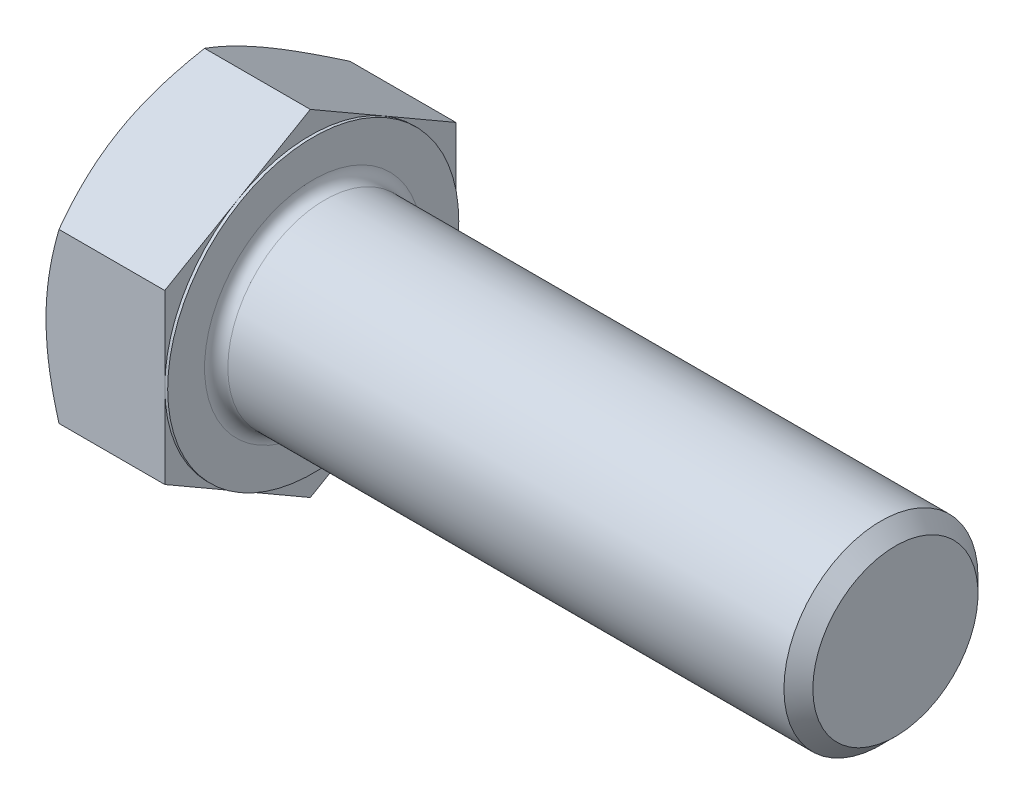
ISO-10303-21;
HEADER;
FILE_DESCRIPTION(('STEP AP214'),'2;1');
FILE_NAME('part.step','',(''),(''),'','','');
FILE_SCHEMA(('AUTOMOTIVE_DESIGN { 1 0 10303 214 1 1 1 1 }'));
ENDSEC;
DATA;
#1=APPLICATION_CONTEXT('core data for automotive mechanical design processes');
#2=APPLICATION_PROTOCOL_DEFINITION('international standard','automotive_design',2000,#1);
#3=PRODUCT_CONTEXT('',#1,'mechanical');
#4=PRODUCT('Part','Part','',(#3));
#5=PRODUCT_RELATED_PRODUCT_CATEGORY('part','',(#4));
#6=PRODUCT_DEFINITION_FORMATION('','',#4);
#7=PRODUCT_DEFINITION_CONTEXT('part definition',#1,'design');
#8=PRODUCT_DEFINITION('design','',#6,#7);
#9=PRODUCT_DEFINITION_SHAPE('','',#8);
#10=(LENGTH_UNIT() NAMED_UNIT(*) SI_UNIT(.MILLI.,.METRE.));
#11=(NAMED_UNIT(*) PLANE_ANGLE_UNIT() SI_UNIT($,.RADIAN.));
#12=(NAMED_UNIT(*) SI_UNIT($,.STERADIAN.) SOLID_ANGLE_UNIT());
#13=UNCERTAINTY_MEASURE_WITH_UNIT(LENGTH_MEASURE(1.E-05),#10,'distance_accuracy_value','');
#14=(GEOMETRIC_REPRESENTATION_CONTEXT(3) GLOBAL_UNCERTAINTY_ASSIGNED_CONTEXT((#13)) GLOBAL_UNIT_ASSIGNED_CONTEXT((#10,
#11,#12)) REPRESENTATION_CONTEXT('',''));
#15=CARTESIAN_POINT('',(0.,0.,0.));
#16=DIRECTION('',(0.,0.,1.));
#17=DIRECTION('',(1.,0.,0.));
#18=AXIS2_PLACEMENT_3D('',#15,#16,#17);
#19=CARTESIAN_POINT('',(15.9258,21.9970452561248,0.));
#20=DIRECTION('',(1.,0.,0.));
#21=DIRECTION('',(0.,0.,-1.));
#22=AXIS2_PLACEMENT_3D('',#19,#20,#21);
#23=PLANE('',#22);
#24=CARTESIAN_POINT('',(15.9258,0.,0.));
#25=DIRECTION('',(1.,0.,0.));
#26=DIRECTION('',(0.,0.,-1.));
#27=AXIS2_PLACEMENT_3D('',#24,#25,#26);
#28=CIRCLE('',#27,14.224);
#29=CARTESIAN_POINT('',(15.9258,0.,-14.224));
#30=VERTEX_POINT('',#29);
#31=EDGE_CURVE('E40',#30,#30,#28,.F.);
#32=ORIENTED_EDGE('',*,*,#31,.T.);
#33=EDGE_LOOP('',(#32));
#34=FACE_BOUND('',#33,.T.);
#35=CARTESIAN_POINT('',(15.9258,0.,0.));
#36=DIRECTION('',(1.,0.,0.));
#37=DIRECTION('',(0.,0.,-1.));
#38=AXIS2_PLACEMENT_3D('',#35,#36,#37);
#39=CIRCLE('',#38,19.05);
#40=CARTESIAN_POINT('',(15.9258,0.,-19.05));
#41=VERTEX_POINT('',#40);
#42=EDGE_CURVE('E291',#41,#41,#39,.T.);
#43=ORIENTED_EDGE('',*,*,#42,.T.);
#44=EDGE_LOOP('',(#43));
#45=FACE_BOUND('',#44,.T.);
#46=ADVANCED_FACE('F32',(#34,#45),#23,.T.);
#47=CARTESIAN_POINT('',(0.,0.,0.));
#48=DIRECTION('',(-1.,0.,0.));
#49=DIRECTION('',(0.,0.,1.));
#50=AXIS2_PLACEMENT_3D('',#47,#48,#49);
#51=CYLINDRICAL_SURFACE('',#50,12.7);
#52=CARTESIAN_POINT('',(17.4498,0.,0.));
#53=DIRECTION('',(1.,0.,0.));
#54=DIRECTION('',(0.,0.,-1.));
#55=AXIS2_PLACEMENT_3D('',#52,#53,#54);
#56=CIRCLE('',#55,12.7);
#57=CARTESIAN_POINT('',(17.4498,0.,-12.7));
#58=VERTEX_POINT('',#57);
#59=EDGE_CURVE('E11',#58,#58,#56,.T.);
#60=ORIENTED_EDGE('',*,*,#59,.T.);
#61=EDGE_LOOP('',(#60));
#62=FACE_BOUND('',#61,.T.);
#63=CARTESIAN_POINT('',(90.2335,0.,0.));
#64=DIRECTION('',(-1.,0.,0.));
#65=DIRECTION('',(0.,0.,1.));
#66=AXIS2_PLACEMENT_3D('',#63,#64,#65);
#67=CIRCLE('',#66,12.7);
#68=CARTESIAN_POINT('',(90.2335,0.,12.7));
#69=VERTEX_POINT('',#68);
#70=EDGE_CURVE('E270',#69,#69,#67,.T.);
#71=ORIENTED_EDGE('',*,*,#70,.T.);
#72=EDGE_LOOP('',(#71));
#73=FACE_BOUND('',#72,.T.);
#74=ADVANCED_FACE('F244',(#62,#73),#51,.T.);
#75=CARTESIAN_POINT('',(92.1258,0.,0.));
#76=DIRECTION('',(-1.,0.,0.));
#77=DIRECTION('',(0.,0.,1.));
#78=AXIS2_PLACEMENT_3D('',#75,#76,#77);
#79=CONICAL_SURFACE('',#78,10.8077,0.785398163397441);
#80=ORIENTED_EDGE('',*,*,#70,.F.);
#81=EDGE_LOOP('',(#80));
#82=FACE_BOUND('',#81,.T.);
#83=CARTESIAN_POINT('',(92.1258,0.,0.));
#84=DIRECTION('',(-1.,0.,0.));
#85=DIRECTION('',(0.,0.,1.));
#86=AXIS2_PLACEMENT_3D('',#83,#84,#85);
#87=CIRCLE('',#86,10.8077);
#88=CARTESIAN_POINT('',(92.1258,0.,10.8077));
#89=VERTEX_POINT('',#88);
#90=EDGE_CURVE('E268',#89,#89,#87,.T.);
#91=ORIENTED_EDGE('',*,*,#90,.T.);
#92=EDGE_LOOP('',(#91));
#93=FACE_BOUND('',#92,.T.);
#94=ADVANCED_FACE('F249',(#82,#93),#79,.T.);
#95=CARTESIAN_POINT('',(92.1258,0.,0.));
#96=DIRECTION('',(-1.,0.,0.));
#97=DIRECTION('',(0.,0.,1.));
#98=AXIS2_PLACEMENT_3D('',#95,#96,#97);
#99=PLANE('',#98);
#100=ORIENTED_EDGE('',*,*,#90,.F.);
#101=EDGE_LOOP('',(#100));
#102=FACE_BOUND('',#101,.T.);
#103=ADVANCED_FACE('F256',(#102),#99,.F.);
#104=CARTESIAN_POINT('',(15.5448,19.05,0.));
#105=DIRECTION('',(1.,0.,0.));
#106=DIRECTION('',(0.,0.,-1.));
#107=AXIS2_PLACEMENT_3D('',#104,#105,#106);
#108=PLANE('',#107);
#109=DIRECTION('',(0.,0.500000000000001,0.866025403784438));
#110=VECTOR('',#109,1.);
#111=CARTESIAN_POINT('',(15.5448,10.9985226280624,-19.05));
#112=LINE('',#111,#110);
#113=CARTESIAN_POINT('',(15.5448,10.9985226280624,-19.05));
#114=VERTEX_POINT('',#113);
#115=CARTESIAN_POINT('',(15.5448,16.4977839420935,-9.52500000000002));
#116=VERTEX_POINT('',#115);
#117=EDGE_CURVE('E164',#114,#116,#112,.T.);
#118=ORIENTED_EDGE('',*,*,#117,.T.);
#119=CARTESIAN_POINT('',(15.5448,0.,0.));
#120=DIRECTION('',(-1.,0.,0.));
#121=DIRECTION('',(0.,0.,1.));
#122=AXIS2_PLACEMENT_3D('',#119,#120,#121);
#123=CIRCLE('',#122,19.05);
#124=CARTESIAN_POINT('',(15.5448,0.,-19.05));
#125=VERTEX_POINT('',#124);
#126=EDGE_CURVE('E47',#116,#125,#123,.T.);
#127=ORIENTED_EDGE('',*,*,#126,.T.);
#128=DIRECTION('',(0.,1.,0.));
#129=VECTOR('',#128,1.);
#130=CARTESIAN_POINT('',(15.5448,10.9985226280624,-19.05));
#131=LINE('',#130,#129);
#132=EDGE_CURVE('E294',#125,#114,#131,.T.);
#133=ORIENTED_EDGE('',*,*,#132,.T.);
#134=EDGE_LOOP('',(#118,#127,#133));
#135=FACE_BOUND('',#134,.T.);
#136=ADVANCED_FACE('F259',(#135),#108,.T.);
#137=CARTESIAN_POINT('',(15.5448,21.9970452561248,0.));
#138=VERTEX_POINT('',#137);
#139=EDGE_CURVE('E162',#116,#138,#112,.T.);
#140=ORIENTED_EDGE('',*,*,#139,.T.);
#141=DIRECTION('',(0.,-0.500000000000001,0.866025403784438));
#142=VECTOR('',#141,1.);
#143=CARTESIAN_POINT('',(15.5448,21.9970452561248,0.));
#144=LINE('',#143,#142);
#145=CARTESIAN_POINT('',(15.5448,16.4977839420935,9.52500000000001));
#146=VERTEX_POINT('',#145);
#147=EDGE_CURVE('E161',#138,#146,#144,.T.);
#148=ORIENTED_EDGE('',*,*,#147,.T.);
#149=EDGE_CURVE('E150',#146,#116,#123,.T.);
#150=ORIENTED_EDGE('',*,*,#149,.T.);
#151=EDGE_LOOP('',(#140,#148,#150));
#152=FACE_BOUND('',#151,.T.);
#153=ADVANCED_FACE('F264',(#152),#108,.T.);
#154=CARTESIAN_POINT('',(15.5448,10.9985226280624,19.05));
#155=VERTEX_POINT('',#154);
#156=EDGE_CURVE('E129',#146,#155,#144,.T.);
#157=ORIENTED_EDGE('',*,*,#156,.T.);
#158=DIRECTION('',(0.,-1.,0.));
#159=VECTOR('',#158,1.);
#160=CARTESIAN_POINT('',(15.5448,10.9985226280624,19.05));
#161=LINE('',#160,#159);
#162=CARTESIAN_POINT('',(15.5448,0.,19.05));
#163=VERTEX_POINT('',#162);
#164=EDGE_CURVE('E123',#155,#163,#161,.T.);
#165=ORIENTED_EDGE('',*,*,#164,.T.);
#166=EDGE_CURVE('E127',#163,#146,#123,.T.);
#167=ORIENTED_EDGE('',*,*,#166,.T.);
#168=EDGE_LOOP('',(#157,#165,#167));
#169=FACE_BOUND('',#168,.T.);
#170=ADVANCED_FACE('F125',(#169),#108,.T.);
#171=CARTESIAN_POINT('',(15.5448,-10.9985226280623,19.05));
#172=VERTEX_POINT('',#171);
#173=EDGE_CURVE('E133',#163,#172,#161,.T.);
#174=ORIENTED_EDGE('',*,*,#173,.T.);
#175=DIRECTION('',(0.,-0.500000000000002,-0.866025403784438));
#176=VECTOR('',#175,1.);
#177=CARTESIAN_POINT('',(15.5448,-21.9970452561248,0.));
#178=LINE('',#177,#176);
#179=CARTESIAN_POINT('',(15.5448,-16.4977839420935,9.52500000000003));
#180=VERTEX_POINT('',#179);
#181=EDGE_CURVE('E140',#172,#180,#178,.T.);
#182=ORIENTED_EDGE('',*,*,#181,.T.);
#183=EDGE_CURVE('E137',#180,#163,#123,.T.);
#184=ORIENTED_EDGE('',*,*,#183,.T.);
#185=EDGE_LOOP('',(#174,#182,#184));
#186=FACE_BOUND('',#185,.T.);
#187=ADVANCED_FACE('F138',(#186),#108,.T.);
#188=CARTESIAN_POINT('',(15.5448,-21.9970452561248,0.));
#189=VERTEX_POINT('',#188);
#190=EDGE_CURVE('E156',#180,#189,#178,.T.);
#191=ORIENTED_EDGE('',*,*,#190,.T.);
#192=DIRECTION('',(0.,0.5,-0.866025403784439));
#193=VECTOR('',#192,1.);
#194=CARTESIAN_POINT('',(15.5448,-10.9985226280624,-19.05));
#195=LINE('',#194,#193);
#196=CARTESIAN_POINT('',(15.5448,-16.4977839420936,-9.525));
#197=VERTEX_POINT('',#196);
#198=EDGE_CURVE('E332',#189,#197,#195,.T.);
#199=ORIENTED_EDGE('',*,*,#198,.T.);
#200=EDGE_CURVE('E144',#197,#180,#123,.T.);
#201=ORIENTED_EDGE('',*,*,#200,.T.);
#202=EDGE_LOOP('',(#191,#199,#201));
#203=FACE_BOUND('',#202,.T.);
#204=ADVANCED_FACE('F333',(#203),#108,.T.);
#205=CARTESIAN_POINT('',(15.5448,-10.9985226280624,-19.05));
#206=VERTEX_POINT('',#205);
#207=EDGE_CURVE('E151',#197,#206,#195,.T.);
#208=ORIENTED_EDGE('',*,*,#207,.T.);
#209=EDGE_CURVE('E295',#206,#125,#131,.T.);
#210=ORIENTED_EDGE('',*,*,#209,.T.);
#211=EDGE_CURVE('E302',#125,#197,#123,.T.);
#212=ORIENTED_EDGE('',*,*,#211,.T.);
#213=EDGE_LOOP('',(#208,#210,#212));
#214=FACE_BOUND('',#213,.T.);
#215=ADVANCED_FACE('F265',(#214),#108,.T.);
#216=CARTESIAN_POINT('',(0.,0.,0.));
#217=DIRECTION('',(-1.,0.,0.));
#218=DIRECTION('',(0.,0.,1.));
#219=AXIS2_PLACEMENT_3D('',#216,#217,#218);
#220=CYLINDRICAL_SURFACE('',#219,19.05);
#221=ORIENTED_EDGE('',*,*,#126,.F.);
#222=ORIENTED_EDGE('',*,*,#149,.F.);
#223=ORIENTED_EDGE('',*,*,#166,.F.);
#224=ORIENTED_EDGE('',*,*,#183,.F.);
#225=ORIENTED_EDGE('',*,*,#200,.F.);
#226=ORIENTED_EDGE('',*,*,#211,.F.);
#227=EDGE_LOOP('',(#221,#222,#223,#224,#225,#226));
#228=FACE_BOUND('',#227,.T.);
#229=ORIENTED_EDGE('',*,*,#42,.F.);
#230=EDGE_LOOP('',(#229));
#231=FACE_BOUND('',#230,.T.);
#232=ADVANCED_FACE('F147',(#228,#231),#220,.T.);
#233=CARTESIAN_POINT('',(0.,21.9970452561248,0.));
#234=DIRECTION('',(1.,0.,0.));
#235=DIRECTION('',(0.,0.,-1.));
#236=AXIS2_PLACEMENT_3D('',#233,#234,#235);
#237=PLANE('',#236);
#238=CARTESIAN_POINT('',(0.,0.,0.));
#239=DIRECTION('',(1.,0.,0.));
#240=DIRECTION('',(0.,0.,-1.));
#241=AXIS2_PLACEMENT_3D('',#238,#239,#240);
#242=CIRCLE('',#241,19.05);
#243=CARTESIAN_POINT('',(0.,0.,-19.05));
#244=VERTEX_POINT('',#243);
#245=CARTESIAN_POINT('',(0.,16.4977839420935,-9.52500000000003));
#246=VERTEX_POINT('',#245);
#247=EDGE_CURVE('E290',#244,#246,#242,.T.);
#248=ORIENTED_EDGE('',*,*,#247,.F.);
#249=CARTESIAN_POINT('',(0.,-16.4977839420936,-9.525));
#250=VERTEX_POINT('',#249);
#251=EDGE_CURVE('E286',#250,#244,#242,.T.);
#252=ORIENTED_EDGE('',*,*,#251,.F.);
#253=CARTESIAN_POINT('',(0.,-16.4977839420935,9.52500000000004));
#254=VERTEX_POINT('',#253);
#255=EDGE_CURVE('E289',#254,#250,#242,.T.);
#256=ORIENTED_EDGE('',*,*,#255,.F.);
#257=CARTESIAN_POINT('',(0.,0.,19.05));
#258=VERTEX_POINT('',#257);
#259=EDGE_CURVE('E325',#258,#254,#242,.T.);
#260=ORIENTED_EDGE('',*,*,#259,.F.);
#261=CARTESIAN_POINT('',(0.,0.,0.));
#262=DIRECTION('',(-1.,0.,0.));
#263=DIRECTION('',(0.,0.,1.));
#264=AXIS2_PLACEMENT_3D('',#261,#262,#263);
#265=CIRCLE('',#264,19.05);
#266=CARTESIAN_POINT('',(0.,16.4977839420935,9.52500000000002));
#267=VERTEX_POINT('',#266);
#268=EDGE_CURVE('E165',#258,#267,#265,.T.);
#269=ORIENTED_EDGE('',*,*,#268,.T.);
#270=EDGE_CURVE('E348',#246,#267,#242,.T.);
#271=ORIENTED_EDGE('',*,*,#270,.F.);
#272=EDGE_LOOP('',(#248,#252,#256,#260,#269,#271));
#273=FACE_BOUND('',#272,.T.);
#274=ADVANCED_FACE('F194',(#273),#237,.F.);
#275=CARTESIAN_POINT('',(0.,0.,0.));
#276=DIRECTION('',(1.,0.,0.));
#277=DIRECTION('',(0.,0.,-1.));
#278=AXIS2_PLACEMENT_3D('',#275,#276,#277);
#279=CONICAL_SURFACE('',#278,19.05,1.0471975511966);
#280=CARTESIAN_POINT('',(1.70154403912922,10.9984071580085,19.0502));
#281=CARTESIAN_POINT('',(1.56198341710822,11.2401500998157,18.6314889424188));
#282=CARTESIAN_POINT('',(1.42875584552932,11.4828359688097,18.2111446870423));
#283=CARTESIAN_POINT('',(1.17672716507821,11.9701537586587,17.3670855155916));
#284=CARTESIAN_POINT('',(1.05793080103127,12.2147862915388,16.9433695394589));
#285=CARTESIAN_POINT('',(0.836361403470764,12.7064702045736,16.0917480208184));
#286=CARTESIAN_POINT('',(0.733626282713289,12.9535258874196,15.6638350258304));
#287=CARTESIAN_POINT('',(0.546385434087814,13.4493539264829,14.8050356703556));
#288=CARTESIAN_POINT('',(0.461878662220418,13.6981261835436,14.374149481613));
#289=CARTESIAN_POINT('',(0.314688827717642,14.1910129913057,13.5204444881885));
#290=CARTESIAN_POINT('',(0.251518592005305,14.4350909503539,13.0976890621094));
#291=CARTESIAN_POINT('',(0.145596345015135,14.9243652652118,12.250241089937));
#292=CARTESIAN_POINT('',(0.102844726760496,15.1695616424575,11.8255485067157));
#293=CARTESIAN_POINT('',(0.0388391678998703,15.6603662788229,10.9754499399404));
#294=CARTESIAN_POINT('',(0.0175596817216254,15.9059736994695,10.5500454086646));
#295=CARTESIAN_POINT('',(-0.00304398488096484,16.397415240843,9.69884369005561));
#296=CARTESIAN_POINT('',(-0.00236884372942214,16.6432493543302,9.27304651526214));
#297=CARTESIAN_POINT('',(0.0194033988503065,17.1028414572046,8.47700964232625));
#298=CARTESIAN_POINT('',(0.0378455699352642,17.316632193386,8.10671322507253));
#299=CARTESIAN_POINT('',(0.0909844304102539,17.7437036919859,7.36700369103291));
#300=CARTESIAN_POINT('',(0.125680887003949,17.9569844616643,6.9975905616726));
#301=CARTESIAN_POINT('',(0.210726274890316,18.3829552210812,6.25978756382389));
#302=CARTESIAN_POINT('',(0.261089360566669,18.5956445003966,5.89139892582437));
#303=CARTESIAN_POINT('',(0.376579300829342,19.0200105686625,5.15637533457961));
#304=CARTESIAN_POINT('',(0.441706092858128,19.2316873618992,4.78974037391031));
#305=CARTESIAN_POINT('',(0.660888399543254,19.8742595388301,3.6767727159359));
#306=CARTESIAN_POINT('',(0.836799169320444,20.3032941041457,2.93366305060604));
#307=CARTESIAN_POINT('',(1.23604434094318,21.1549659135281,1.45852420538159));
#308=CARTESIAN_POINT('',(1.45928498251531,21.5776140613123,0.726476139694542));
#309=CARTESIAN_POINT('',(1.70154403912923,21.9971607261786,-0.000199999999998891));
#310=B_SPLINE_CURVE_WITH_KNOTS('',3,(#280,#281,#282,#283,#284,#285,#286,#287,#288,#289,#290,
#291,#292,#293,#294,#295,#296,#297,#298,#299,#300,#301,#302,#303,#304,#305,#306,#307,#308,#309),
.UNSPECIFIED.,.F.,.F.,(4,2,2,2,2,2,2,2,2,2,2,2,2,2,4),(0.,1.50971559281794,3.01992622800796,
4.53364959201313,6.04728623691163,7.52356313869613,8.99986845512143,10.4744153207586,
11.9489166211861,13.2325441548787,14.5161533048254,15.8009255464228,17.085692344219,
19.7118183650731,22.3327898553892),.UNSPECIFIED.);
#311=CARTESIAN_POINT('',(1.70147737193763,21.9970452561248,0.));
#312=VERTEX_POINT('',#311);
#313=EDGE_CURVE('E213',#267,#312,#310,.T.);
#314=ORIENTED_EDGE('',*,*,#313,.T.);
#315=CARTESIAN_POINT('',(1.70154403912923,21.9971607261786,0.0002));
#316=CARTESIAN_POINT('',(1.56198341710824,21.7554177843714,-0.418511057581224));
#317=CARTESIAN_POINT('',(1.42875584552933,21.5127319153775,-0.83885531295774));
#318=CARTESIAN_POINT('',(1.17672716507822,21.0254141255284,-1.68291448440842));
#319=CARTESIAN_POINT('',(1.05793080103128,20.7807815926483,-2.10663046054107));
#320=CARTESIAN_POINT('',(0.83636140347077,20.2890976796135,-2.95825197918165));
#321=CARTESIAN_POINT('',(0.733626282713295,20.0420419967675,-3.38616497416956));
#322=CARTESIAN_POINT('',(0.546385434087819,19.5462139577042,-4.24496432964444));
#323=CARTESIAN_POINT('',(0.461878662220422,19.2974417006436,-4.67585051838702));
#324=CARTESIAN_POINT('',(0.314688827717645,18.8045548928814,-5.5295555118115));
#325=CARTESIAN_POINT('',(0.251518592005309,18.5604769338332,-5.95231093789062));
#326=CARTESIAN_POINT('',(0.145596345015138,18.0712026189753,-6.79975891006299));
#327=CARTESIAN_POINT('',(0.102844726760496,17.8260062417296,-7.22445149328434));
#328=CARTESIAN_POINT('',(0.0388391678998689,17.3352016053642,-8.07455006005963));
#329=CARTESIAN_POINT('',(0.0175596817216244,17.0895941847176,-8.49995459133542));
#330=CARTESIAN_POINT('',(-0.00304398488096682,16.5981526433441,-9.3511563099444));
#331=CARTESIAN_POINT('',(-0.00236884372942559,16.3523185298569,-9.77695348473787));
#332=CARTESIAN_POINT('',(0.0194033988503021,15.8927264269825,-10.5729903576738));
#333=CARTESIAN_POINT('',(0.03784556993526,15.6789356908011,-10.9432867749275));
#334=CARTESIAN_POINT('',(0.0909844304102486,15.2518641922012,-11.6829963089671));
#335=CARTESIAN_POINT('',(0.125680887003942,15.0385834225228,-12.0524094383274));
#336=CARTESIAN_POINT('',(0.210726274890309,14.612612663106,-12.7902124361761));
#337=CARTESIAN_POINT('',(0.261089360566662,14.3999233837905,-13.1586010741756));
#338=CARTESIAN_POINT('',(0.376579300829333,13.9755573155246,-13.8936246654204));
#339=CARTESIAN_POINT('',(0.441706092858117,13.7638805222879,-14.2602596260897));
#340=CARTESIAN_POINT('',(0.660888399543239,13.121308345357,-15.3732272840641));
#341=CARTESIAN_POINT('',(0.83679916932043,12.6922737800414,-16.116336949394));
#342=CARTESIAN_POINT('',(1.23604434094317,11.840601970659,-17.5914757946184));
#343=CARTESIAN_POINT('',(1.4592849825153,11.4179538228748,-18.3235238603055));
#344=CARTESIAN_POINT('',(1.70154403912921,10.9984071580085,-19.0502));
#345=B_SPLINE_CURVE_WITH_KNOTS('',3,(#315,#316,#317,#318,#319,#320,#321,#322,#323,#324,#325,
#326,#327,#328,#329,#330,#331,#332,#333,#334,#335,#336,#337,#338,#339,#340,#341,#342,#343,#344),
.UNSPECIFIED.,.F.,.F.,(4,2,2,2,2,2,2,2,2,2,2,2,2,2,4),(0.,1.50971559281794,3.01992622800796,
4.53364959201314,6.04728623691164,7.52356313869613,8.99986845512143,10.4744153207586,
11.9489166211861,13.2325441548787,14.5161533048254,15.8009255464228,17.085692344219,
19.7118183650731,22.3327898553892),.UNSPECIFIED.);
#346=EDGE_CURVE('E55',#312,#246,#345,.T.);
#347=ORIENTED_EDGE('',*,*,#346,.T.);
#348=ORIENTED_EDGE('',*,*,#270,.T.);
#349=EDGE_LOOP('',(#314,#347,#348));
#350=FACE_BOUND('',#349,.T.);
#351=ADVANCED_FACE('F349',(#350),#279,.T.);
#352=CARTESIAN_POINT('',(9.36387045247343,-29.681284606613,19.05));
#353=CARTESIAN_POINT('',(9.16146582961974,-29.264706606806,19.05));
#354=CARTESIAN_POINT('',(8.96006010911688,-28.8476434945091,19.05));
#355=CARTESIAN_POINT('',(8.55947242837995,-28.0124458613825,19.05));
#356=CARTESIAN_POINT('',(8.36029049009429,-27.5943113300281,19.05));
#357=CARTESIAN_POINT('',(7.7663676810725,-26.3380393948462,19.05));
#358=CARTESIAN_POINT('',(7.37530881268534,-25.498154743662,19.05));
#359=CARTESIAN_POINT('',(6.60327220097087,-23.808305939745,19.05));
#360=CARTESIAN_POINT('',(6.22235974347411,-22.9583118892264,19.05));
#361=CARTESIAN_POINT('',(5.47593301915302,-21.2516124787001,19.05));
#362=CARTESIAN_POINT('',(5.11041803414068,-20.3949074339305,19.05));
#363=CARTESIAN_POINT('',(4.38719116879672,-18.6452025304738,19.05));
#364=CARTESIAN_POINT('',(4.03012757182363,-17.7519333199389,19.05));
#365=CARTESIAN_POINT('',(3.34269044233918,-15.9549889007312,19.05));
#366=CARTESIAN_POINT('',(3.01231988615571,-15.0513125444405,19.05));
#367=CARTESIAN_POINT('',(2.38684616332965,-13.2337927829517,19.05));
#368=CARTESIAN_POINT('',(2.09167277054079,-12.3199737386897,19.05));
#369=CARTESIAN_POINT('',(1.54595671315604,-10.4791413209231,19.05));
#370=CARTESIAN_POINT('',(1.29540013570895,-9.55213215820611,19.05));
#371=CARTESIAN_POINT('',(0.962715893913424,-8.15413474991851,19.05));
#372=CARTESIAN_POINT('',(0.859241701469715,-7.68819648348643,19.05));
#373=CARTESIAN_POINT('',(0.667894608167373,-6.75311076402833,19.05));
#374=CARTESIAN_POINT('',(0.580021393447899,-6.28396337576073,19.05));
#375=CARTESIAN_POINT('',(0.421420281134063,-5.34278179688777,19.05));
#376=CARTESIAN_POINT('',(0.350691777614133,-4.87074770890834,19.05));
#377=CARTESIAN_POINT('',(0.227781142117217,-3.92425443579507,19.05));
#378=CARTESIAN_POINT('',(0.175598996477116,-3.44979525244806,19.05));
#379=CARTESIAN_POINT('',(0.091484358665081,-2.50539642167933,19.05));
#380=CARTESIAN_POINT('',(0.0592932834122934,-2.03547994750786,19.05));
#381=CARTESIAN_POINT('',(0.0148196511049127,-1.09470720819043,19.05));
#382=CARTESIAN_POINT('',(0.00253675993371639,-0.623850958949376,19.05));
#383=CARTESIAN_POINT('',(-0.00182781610310269,0.317959597669875,19.05));
#384=CARTESIAN_POINT('',(0.00609054987868912,0.788913905291908,19.05));
#385=CARTESIAN_POINT('',(0.0419336308306925,1.73006593492375,19.05));
#386=CARTESIAN_POINT('',(0.0698592408268269,2.20026362214292,19.05));
#387=CARTESIAN_POINT('',(0.160085140812835,3.32615149168687,19.05));
#388=CARTESIAN_POINT('',(0.231647760253748,3.9811127561872,19.05));
#389=CARTESIAN_POINT('',(0.409728300065855,5.2862687094639,19.05));
#390=CARTESIAN_POINT('',(0.516250858977386,5.93646275400804,19.05));
#391=CARTESIAN_POINT('',(0.760462128297077,7.23143263105088,19.05));
#392=CARTESIAN_POINT('',(0.898174747996119,7.87620391130365,19.05));
#393=CARTESIAN_POINT('',(1.20055584405695,9.159324879215,19.05));
#394=CARTESIAN_POINT('',(1.36522394390489,9.79767465643689,19.05));
#395=CARTESIAN_POINT('',(1.7214113056863,11.0820581020298,19.05));
#396=CARTESIAN_POINT('',(1.91344522350516,11.7279480495079,19.05));
#397=CARTESIAN_POINT('',(2.31762854711575,13.0133672560354,19.05));
#398=CARTESIAN_POINT('',(2.52977808690826,13.6528964726813,19.05));
#399=CARTESIAN_POINT('',(2.97080026317714,14.9259053212631,19.05));
#400=CARTESIAN_POINT('',(3.19966751894679,15.5593868261181,19.05));
#401=CARTESIAN_POINT('',(3.67140574966712,16.8210826190597,19.05));
#402=CARTESIAN_POINT('',(3.91427655235636,17.4492969718302,19.05));
#403=CARTESIAN_POINT('',(4.50783243685458,18.9429543286684,19.05));
#404=CARTESIAN_POINT('',(4.86391009787127,19.8062512923856,19.05));
#405=CARTESIAN_POINT('',(5.59369975040599,21.5253820385326,19.05));
#406=CARTESIAN_POINT('',(5.96741288850359,22.3812153314103,19.05));
#407=CARTESIAN_POINT('',(6.72890710622893,24.0868250540015,19.05));
#408=CARTESIAN_POINT('',(7.11669148004349,24.9366000089695,19.05));
#409=CARTESIAN_POINT('',(7.90345923334426,26.63091294583,19.05));
#410=CARTESIAN_POINT('',(8.3024423596857,27.4754510455742,19.05));
#411=CARTESIAN_POINT('',(9.10995217038491,29.161125765359,19.05));
#412=CARTESIAN_POINT('',(9.5184891939498,30.0022574236751,19.05));
#413=CARTESIAN_POINT('',(10.3430229269526,31.6808559628692,19.05));
#414=CARTESIAN_POINT('',(10.7590196703666,32.518322827034,19.05));
#415=CARTESIAN_POINT('',(11.5971269180795,34.1900490644371,19.05));
#416=CARTESIAN_POINT('',(12.0192366018988,35.0243088494536,19.05));
#417=CARTESIAN_POINT('',(12.8686125952728,36.6901944514231,19.05));
#418=CARTESIAN_POINT('',(13.2958788947363,37.5218202735267,19.05));
#419=CARTESIAN_POINT('',(14.510917657863,39.8716762337095,19.05));
#420=CARTESIAN_POINT('',(15.3037675196573,41.3872809173331,19.05));
#421=CARTESIAN_POINT('',(16.9002701357266,44.4128482567193,19.05));
#422=CARTESIAN_POINT('',(17.7039232916796,45.9228107000148,19.05));
#423=CARTESIAN_POINT('',(19.3174048995091,48.9344252680923,19.05));
#424=CARTESIAN_POINT('',(20.1272121106646,50.4360887804975,19.05));
#425=CARTESIAN_POINT('',(21.3467150335648,52.6859282817833,19.05));
#426=CARTESIAN_POINT('',(21.7540032158491,53.4354111964365,19.05));
#427=CARTESIAN_POINT('',(22.5700166567681,54.9335928565355,19.05));
#428=CARTESIAN_POINT('',(22.9787419131725,55.6822916031958,19.05));
#429=CARTESIAN_POINT('',(23.3881024870587,56.4306429205237,19.05));
#430=B_SPLINE_CURVE_WITH_KNOTS('',3,(#352,#353,#354,#355,#356,#357,#358,#359,#360,#361,#362,
#363,#364,#365,#366,#367,#368,#369,#370,#371,#372,#373,#374,#375,#376,#377,#378,#379,#380,#381,
#382,#383,#384,#385,#386,#387,#388,#389,#390,#391,#392,#393,#394,#395,#396,#397,#398,#399,#400,
#401,#402,#403,#404,#405,#406,#407,#408,#409,#410,#411,#412,#413,#414,#415,#416,#417,#418,#419,
#420,#421,#422,#423,#424,#425,#426,#427,#428,#429),.UNSPECIFIED.,.F.,.F.,(4,2,2,2,2,2,2,2,2,2,2,
2,2,2,2,2,2,2,2,2,2,2,2,2,2,2,2,2,2,2,2,2,2,2,2,2,2,2,4),(0.,1.38943761217531,2.77888892580274,
5.55819563283588,8.35240254614278,11.1464789839499,14.0321224955357,16.9180873194337,
19.7981940796754,22.6774011581476,24.1090510836395,25.5406722038995,26.9722427206616,
28.4038121827825,29.8164561105849,31.2290763299128,32.6417001048686,34.0543870776267,
36.0298747033623,38.0056245459738,39.9828940915955,41.9601360210948,43.9812438973033,
46.0023652381249,48.0228389099964,50.0432877327721,52.8445655115302,55.6460256683976,
58.4481459548751,61.2502029511148,64.0554471757798,66.8607041804397,69.665588089998,
72.4704665113671,77.6017760453958,82.7332768976462,87.8515588562165,90.4105564703669,
92.9695501149091),.UNSPECIFIED.);
#431=CARTESIAN_POINT('',(1.70147737193762,10.9985226280624,19.05));
#432=VERTEX_POINT('',#431);
#433=EDGE_CURVE('E225',#258,#432,#430,.T.);
#434=ORIENTED_EDGE('',*,*,#433,.T.);
#435=EDGE_CURVE('E224',#432,#267,#310,.T.);
#436=ORIENTED_EDGE('',*,*,#435,.T.);
#437=ORIENTED_EDGE('',*,*,#268,.F.);
#438=EDGE_LOOP('',(#434,#436,#437));
#439=FACE_BOUND('',#438,.T.);
#440=ADVANCED_FACE('F319',(#439),#279,.T.);
#441=CARTESIAN_POINT('',(1.70147737193761,-10.9985226280623,19.05));
#442=VERTEX_POINT('',#441);
#443=EDGE_CURVE('E271',#442,#258,#430,.T.);
#444=ORIENTED_EDGE('',*,*,#443,.T.);
#445=ORIENTED_EDGE('',*,*,#259,.T.);
#446=CARTESIAN_POINT('',(1.70154403912923,-21.9971607261786,-0.000200000000000067));
#447=CARTESIAN_POINT('',(1.56198341710824,-21.7554177843714,0.418511057581222));
#448=CARTESIAN_POINT('',(1.42875584552933,-21.5127319153775,0.838855312957738));
#449=CARTESIAN_POINT('',(1.17672716507822,-21.0254141255284,1.68291448440842));
#450=CARTESIAN_POINT('',(1.05793080103128,-20.7807815926483,2.10663046054107));
#451=CARTESIAN_POINT('',(0.836361403470769,-20.2890976796135,2.95825197918165));
#452=CARTESIAN_POINT('',(0.733626282713293,-20.0420419967675,3.38616497416956));
#453=CARTESIAN_POINT('',(0.546385434087817,-19.5462139577042,4.24496432964444));
#454=CARTESIAN_POINT('',(0.461878662220421,-19.2974417006435,4.67585051838702));
#455=CARTESIAN_POINT('',(0.314688827717642,-18.8045548928814,5.5295555118115));
#456=CARTESIAN_POINT('',(0.251518592005304,-18.5604769338332,5.95231093789062));
#457=CARTESIAN_POINT('',(0.145596345015132,-18.0712026189753,6.79975891006298));
#458=CARTESIAN_POINT('',(0.102844726760491,-17.8260062417296,7.22445149328434));
#459=CARTESIAN_POINT('',(0.0388391678998642,-17.3352016053642,8.07455006005963));
#460=CARTESIAN_POINT('',(0.0175596817216182,-17.0895941847176,8.49995459133541));
#461=CARTESIAN_POINT('',(-0.00304398488097359,-16.5981526433441,9.35115630994439));
#462=CARTESIAN_POINT('',(-0.00236884372943127,-16.3523185298569,9.77695348473786));
#463=CARTESIAN_POINT('',(0.0194033988502967,-15.8927264269825,10.5729903576737));
#464=CARTESIAN_POINT('',(0.0378455699352542,-15.6789356908011,10.9432867749275));
#465=CARTESIAN_POINT('',(0.0909844304102423,-15.2518641922012,11.6829963089671));
#466=CARTESIAN_POINT('',(0.125680887003936,-15.0385834225228,12.0524094383274));
#467=CARTESIAN_POINT('',(0.210726274890302,-14.6126126631059,12.7902124361761));
#468=CARTESIAN_POINT('',(0.261089360566655,-14.3999233837905,13.1586010741756));
#469=CARTESIAN_POINT('',(0.376579300829327,-13.9755573155246,13.8936246654204));
#470=CARTESIAN_POINT('',(0.441706092858111,-13.7638805222879,14.2602596260897));
#471=CARTESIAN_POINT('',(0.660888399543233,-13.121308345357,15.3732272840641));
#472=CARTESIAN_POINT('',(0.836799169320424,-12.6922737800414,16.116336949394));
#473=CARTESIAN_POINT('',(1.23604434094316,-11.840601970659,17.5914757946184));
#474=CARTESIAN_POINT('',(1.45928498251529,-11.4179538228748,18.3235238603055));
#475=CARTESIAN_POINT('',(1.70154403912921,-10.9984071580085,19.0502));
#476=B_SPLINE_CURVE_WITH_KNOTS('',3,(#446,#447,#448,#449,#450,#451,#452,#453,#454,#455,#456,
#457,#458,#459,#460,#461,#462,#463,#464,#465,#466,#467,#468,#469,#470,#471,#472,#473,#474,#475),
.UNSPECIFIED.,.F.,.F.,(4,2,2,2,2,2,2,2,2,2,2,2,2,2,4),(0.,1.50971559281794,3.01992622800796,
4.53364959201314,6.04728623691164,7.52356313869613,8.99986845512143,10.4744153207586,
11.9489166211861,13.2325441548787,14.5161533048254,15.8009255464228,17.085692344219,
19.7118183650732,22.3327898553893),.UNSPECIFIED.);
#477=EDGE_CURVE('E215',#254,#442,#476,.T.);
#478=ORIENTED_EDGE('',*,*,#477,.T.);
#479=EDGE_LOOP('',(#444,#445,#478));
#480=FACE_BOUND('',#479,.T.);
#481=ADVANCED_FACE('F183',(#480),#279,.T.);
#482=CARTESIAN_POINT('',(1.70147737193763,-21.9970452561248,0.));
#483=VERTEX_POINT('',#482);
#484=EDGE_CURVE('E208',#483,#254,#476,.T.);
#485=ORIENTED_EDGE('',*,*,#484,.T.);
#486=ORIENTED_EDGE('',*,*,#255,.T.);
#487=CARTESIAN_POINT('',(1.70154403912922,-10.9984071580086,-19.0502));
#488=CARTESIAN_POINT('',(1.56198341710823,-11.2401500998157,-18.6314889424188));
#489=CARTESIAN_POINT('',(1.42875584552933,-11.4828359688097,-18.2111446870423));
#490=CARTESIAN_POINT('',(1.17672716507822,-11.9701537586587,-17.3670855155916));
#491=CARTESIAN_POINT('',(1.05793080103128,-12.2147862915388,-16.9433695394589));
#492=CARTESIAN_POINT('',(0.836361403470769,-12.7064702045737,-16.0917480208183));
#493=CARTESIAN_POINT('',(0.733626282713294,-12.9535258874197,-15.6638350258304));
#494=CARTESIAN_POINT('',(0.546385434087819,-13.449353926483,-14.8050356703556));
#495=CARTESIAN_POINT('',(0.461878662220424,-13.6981261835436,-14.374149481613));
#496=CARTESIAN_POINT('',(0.314688827717648,-14.1910129913057,-13.5204444881885));
#497=CARTESIAN_POINT('',(0.251518592005311,-14.4350909503539,-13.0976890621094));
#498=CARTESIAN_POINT('',(0.145596345015141,-14.9243652652118,-12.250241089937));
#499=CARTESIAN_POINT('',(0.102844726760501,-15.1695616424575,-11.8255485067157));
#500=CARTESIAN_POINT('',(0.0388391678998761,-15.6603662788229,-10.9754499399404));
#501=CARTESIAN_POINT('',(0.0175596817216313,-15.9059736994695,-10.5500454086646));
#502=CARTESIAN_POINT('',(-0.00304398488095869,-16.3974152408431,-9.6988436900556));
#503=CARTESIAN_POINT('',(-0.00236884372941574,-16.6432493543302,-9.27304651526213));
#504=CARTESIAN_POINT('',(0.0194033988503131,-17.1028414572047,-8.47700964232624));
#505=CARTESIAN_POINT('',(0.0378455699352709,-17.316632193386,-8.10671322507252));
#506=CARTESIAN_POINT('',(0.0909844304102597,-17.7437036919859,-7.3670036910329));
#507=CARTESIAN_POINT('',(0.125680887003953,-17.9569844616643,-6.99759056167259));
#508=CARTESIAN_POINT('',(0.210726274890321,-18.3829552210812,-6.25978756382388));
#509=CARTESIAN_POINT('',(0.261089360566673,-18.5956445003966,-5.89139892582437));
#510=CARTESIAN_POINT('',(0.376579300829346,-19.0200105686625,-5.15637533457961));
#511=CARTESIAN_POINT('',(0.441706092858132,-19.2316873618992,-4.78974037391031));
#512=CARTESIAN_POINT('',(0.660888399543257,-19.8742595388301,-3.67677271593589));
#513=CARTESIAN_POINT('',(0.836799169320446,-20.3032941041457,-2.93366305060604));
#514=CARTESIAN_POINT('',(1.23604434094318,-21.1549659135281,-1.45852420538159));
#515=CARTESIAN_POINT('',(1.45928498251531,-21.5776140613123,-0.726476139694542));
#516=CARTESIAN_POINT('',(1.70154403912923,-21.9971607261786,0.000199999999998958));
#517=B_SPLINE_CURVE_WITH_KNOTS('',3,(#487,#488,#489,#490,#491,#492,#493,#494,#495,#496,#497,
#498,#499,#500,#501,#502,#503,#504,#505,#506,#507,#508,#509,#510,#511,#512,#513,#514,#515,#516),
.UNSPECIFIED.,.F.,.F.,(4,2,2,2,2,2,2,2,2,2,2,2,2,2,4),(0.,1.50971559281794,3.01992622800796,
4.53364959201314,6.04728623691163,7.52356313869612,8.99986845512142,10.4744153207586,
11.9489166211861,13.2325441548787,14.5161533048254,15.8009255464228,17.085692344219,
19.7118183650731,22.3327898553892),.UNSPECIFIED.);
#518=EDGE_CURVE('E214',#250,#483,#517,.T.);
#519=ORIENTED_EDGE('',*,*,#518,.T.);
#520=EDGE_LOOP('',(#485,#486,#519));
#521=FACE_BOUND('',#520,.T.);
#522=ADVANCED_FACE('F347',(#521),#279,.T.);
#523=CARTESIAN_POINT('',(1.70147737193761,10.9985226280624,-19.05));
#524=VERTEX_POINT('',#523);
#525=EDGE_CURVE('E216',#246,#524,#345,.T.);
#526=ORIENTED_EDGE('',*,*,#525,.T.);
#527=CARTESIAN_POINT('',(9.36387045247347,-29.6812846066131,-19.05));
#528=CARTESIAN_POINT('',(9.16146582961978,-29.264706606806,-19.05));
#529=CARTESIAN_POINT('',(8.96006010911692,-28.8476434945092,-19.05));
#530=CARTESIAN_POINT('',(8.55947242837999,-28.0124458613826,-19.05));
#531=CARTESIAN_POINT('',(8.36029049009433,-27.5943113300282,-19.05));
#532=CARTESIAN_POINT('',(7.76636768107253,-26.3380393948462,-19.05));
#533=CARTESIAN_POINT('',(7.37530881268537,-25.498154743662,-19.05));
#534=CARTESIAN_POINT('',(6.6032722009709,-23.8083059397451,-19.05));
#535=CARTESIAN_POINT('',(6.22235974347414,-22.9583118892265,-19.05));
#536=CARTESIAN_POINT('',(5.47593301915305,-21.2516124787002,-19.05));
#537=CARTESIAN_POINT('',(5.11041803414071,-20.3949074339305,-19.05));
#538=CARTESIAN_POINT('',(4.38719116879675,-18.6452025304738,-19.05));
#539=CARTESIAN_POINT('',(4.03012757182365,-17.751933319939,-19.05));
#540=CARTESIAN_POINT('',(3.3426904423392,-15.9549889007313,-19.05));
#541=CARTESIAN_POINT('',(3.01231988615573,-15.0513125444405,-19.05));
#542=CARTESIAN_POINT('',(2.38684616332967,-13.2337927829517,-19.05));
#543=CARTESIAN_POINT('',(2.09167277054081,-12.3199737386898,-19.05));
#544=CARTESIAN_POINT('',(1.54595671315605,-10.4791413209232,-19.05));
#545=CARTESIAN_POINT('',(1.29540013570897,-9.55213215820616,-19.05));
#546=CARTESIAN_POINT('',(0.962715893913435,-8.15413474991856,-19.05));
#547=CARTESIAN_POINT('',(0.859241701469724,-7.68819648348648,-19.05));
#548=CARTESIAN_POINT('',(0.66789460816738,-6.75311076402837,-19.05));
#549=CARTESIAN_POINT('',(0.580021393447906,-6.28396337576078,-19.05));
#550=CARTESIAN_POINT('',(0.421420281134069,-5.34278179688782,-19.05));
#551=CARTESIAN_POINT('',(0.350691777614139,-4.87074770890838,-19.05));
#552=CARTESIAN_POINT('',(0.227781142117223,-3.92425443579511,-19.05));
#553=CARTESIAN_POINT('',(0.175598996477123,-3.44979525244811,-19.05));
#554=CARTESIAN_POINT('',(0.0914843586650862,-2.50539642167937,-19.05));
#555=CARTESIAN_POINT('',(0.0592932834122965,-2.03547994750791,-19.05));
#556=CARTESIAN_POINT('',(0.0148196511049136,-1.09470720819047,-19.05));
#557=CARTESIAN_POINT('',(0.00253675993371739,-0.623850958949421,-19.05));
#558=CARTESIAN_POINT('',(-0.00182781610310368,0.317959597669829,-19.05));
#559=CARTESIAN_POINT('',(0.00609054987868606,0.788913905291862,-19.05));
#560=CARTESIAN_POINT('',(0.0419336308306876,1.73006593492371,-19.05));
#561=CARTESIAN_POINT('',(0.0698592408268225,2.20026362214288,-19.05));
#562=CARTESIAN_POINT('',(0.160085140812831,3.32615149168683,-19.05));
#563=CARTESIAN_POINT('',(0.231647760253744,3.98111275618715,-19.05));
#564=CARTESIAN_POINT('',(0.409728300065848,5.28626870946384,-19.05));
#565=CARTESIAN_POINT('',(0.516250858977375,5.93646275400798,-19.05));
#566=CARTESIAN_POINT('',(0.760462128297064,7.23143263105083,-19.05));
#567=CARTESIAN_POINT('',(0.898174747996107,7.87620391130359,-19.05));
#568=CARTESIAN_POINT('',(1.20055584405693,9.15932487921494,-19.05));
#569=CARTESIAN_POINT('',(1.36522394390487,9.79767465643683,-19.05));
#570=CARTESIAN_POINT('',(1.72141130568628,11.0820581020297,-19.05));
#571=CARTESIAN_POINT('',(1.91344522350514,11.7279480495078,-19.05));
#572=CARTESIAN_POINT('',(2.31762854711573,13.0133672560353,-19.05));
#573=CARTESIAN_POINT('',(2.52977808690824,13.6528964726812,-19.05));
#574=CARTESIAN_POINT('',(2.97080026317712,14.9259053212631,-19.05));
#575=CARTESIAN_POINT('',(3.19966751894677,15.5593868261181,-19.05));
#576=CARTESIAN_POINT('',(3.67140574966709,16.8210826190597,-19.05));
#577=CARTESIAN_POINT('',(3.91427655235634,17.4492969718301,-19.05));
#578=CARTESIAN_POINT('',(4.50783243685455,18.9429543286683,-19.05));
#579=CARTESIAN_POINT('',(4.86391009787124,19.8062512923856,-19.05));
#580=CARTESIAN_POINT('',(5.59369975040596,21.5253820385326,-19.05));
#581=CARTESIAN_POINT('',(5.96741288850356,22.3812153314102,-19.05));
#582=CARTESIAN_POINT('',(6.7289071062289,24.0868250540014,-19.05));
#583=CARTESIAN_POINT('',(7.11669148004346,24.9366000089695,-19.05));
#584=CARTESIAN_POINT('',(7.90345923334423,26.63091294583,-19.05));
#585=CARTESIAN_POINT('',(8.30244235968568,27.4754510455741,-19.05));
#586=CARTESIAN_POINT('',(9.10995217038488,29.161125765359,-19.05));
#587=CARTESIAN_POINT('',(9.51848919394977,30.0022574236751,-19.05));
#588=CARTESIAN_POINT('',(10.3430229269526,31.6808559628692,-19.05));
#589=CARTESIAN_POINT('',(10.7590196703666,32.5183228270339,-19.05));
#590=CARTESIAN_POINT('',(11.5971269180795,34.1900490644371,-19.05));
#591=CARTESIAN_POINT('',(12.0192366018987,35.0243088494535,-19.05));
#592=CARTESIAN_POINT('',(12.8686125952728,36.690194451423,-19.05));
#593=CARTESIAN_POINT('',(13.2958788947363,37.5218202735267,-19.05));
#594=CARTESIAN_POINT('',(14.510917657863,39.8716762337095,-19.05));
#595=CARTESIAN_POINT('',(15.3037675196573,41.3872809173331,-19.05));
#596=CARTESIAN_POINT('',(16.9002701357265,44.4128482567192,-19.05));
#597=CARTESIAN_POINT('',(17.7039232916796,45.9228107000148,-19.05));
#598=CARTESIAN_POINT('',(19.3174048995091,48.9344252680923,-19.05));
#599=CARTESIAN_POINT('',(20.1272121106646,50.4360887804975,-19.05));
#600=CARTESIAN_POINT('',(21.3467150335648,52.6859282817833,-19.05));
#601=CARTESIAN_POINT('',(21.7540032158491,53.4354111964365,-19.05));
#602=CARTESIAN_POINT('',(22.5700166567681,54.9335928565355,-19.05));
#603=CARTESIAN_POINT('',(22.9787419131725,55.6822916031957,-19.05));
#604=CARTESIAN_POINT('',(23.3881024870587,56.4306429205237,-19.05));
#605=B_SPLINE_CURVE_WITH_KNOTS('',3,(#527,#528,#529,#530,#531,#532,#533,#534,#535,#536,#537,
#538,#539,#540,#541,#542,#543,#544,#545,#546,#547,#548,#549,#550,#551,#552,#553,#554,#555,#556,
#557,#558,#559,#560,#561,#562,#563,#564,#565,#566,#567,#568,#569,#570,#571,#572,#573,#574,#575,
#576,#577,#578,#579,#580,#581,#582,#583,#584,#585,#586,#587,#588,#589,#590,#591,#592,#593,#594,
#595,#596,#597,#598,#599,#600,#601,#602,#603,#604),.UNSPECIFIED.,.F.,.F.,(4,2,2,2,2,2,2,2,2,2,2,
2,2,2,2,2,2,2,2,2,2,2,2,2,2,2,2,2,2,2,2,2,2,2,2,2,2,2,4),(0.,1.38943761217531,2.77888892580273,
5.55819563283589,8.35240254614279,11.1464789839499,14.0321224955357,16.9180873194338,
19.7981940796754,22.6774011581476,24.1090510836395,25.5406722038995,26.9722427206616,
28.4038121827825,29.816456110585,31.2290763299128,32.6417001048686,34.0543870776267,
36.0298747033624,38.0056245459739,39.9828940915956,41.9601360210948,43.9812438973033,
46.0023652381249,48.0228389099964,50.0432877327721,52.8445655115302,55.6460256683976,
58.4481459548751,61.2502029511148,64.0554471757798,66.8607041804397,69.6655880899981,
72.4704665113671,77.6017760453958,82.7332768976462,87.8515588562165,90.410556470367,
92.9695501149091),.UNSPECIFIED.);
#606=EDGE_CURVE('E176',#524,#244,#605,.F.);
#607=ORIENTED_EDGE('',*,*,#606,.T.);
#608=ORIENTED_EDGE('',*,*,#247,.T.);
#609=EDGE_LOOP('',(#526,#607,#608));
#610=FACE_BOUND('',#609,.T.);
#611=ADVANCED_FACE('F344',(#610),#279,.T.);
#612=CARTESIAN_POINT('',(1.70147737193763,-10.9985226280624,-19.05));
#613=VERTEX_POINT('',#612);
#614=EDGE_CURVE('E177',#613,#250,#517,.T.);
#615=ORIENTED_EDGE('',*,*,#614,.T.);
#616=ORIENTED_EDGE('',*,*,#251,.T.);
#617=EDGE_CURVE('E168',#244,#613,#605,.F.);
#618=ORIENTED_EDGE('',*,*,#617,.T.);
#619=EDGE_LOOP('',(#615,#616,#618));
#620=FACE_BOUND('',#619,.T.);
#621=ADVANCED_FACE('F192',(#620),#279,.T.);
#622=CARTESIAN_POINT('',(15.9258,10.9985226280624,-19.05));
#623=DIRECTION('',(0.,0.,1.));
#624=DIRECTION('',(1.,0.,0.));
#625=AXIS2_PLACEMENT_3D('',#622,#623,#624);
#626=PLANE('',#625);
#627=ORIENTED_EDGE('',*,*,#209,.F.);
#628=DIRECTION('',(-1.,0.,0.));
#629=VECTOR('',#628,1.);
#630=CARTESIAN_POINT('',(15.9258,-10.9985226280624,-19.05));
#631=LINE('',#630,#629);
#632=EDGE_CURVE('E277',#206,#613,#631,.T.);
#633=ORIENTED_EDGE('',*,*,#632,.T.);
#634=ORIENTED_EDGE('',*,*,#617,.F.);
#635=ORIENTED_EDGE('',*,*,#606,.F.);
#636=DIRECTION('',(-1.,0.,0.));
#637=VECTOR('',#636,1.);
#638=CARTESIAN_POINT('',(15.9258,10.9985226280624,-19.05));
#639=LINE('',#638,#637);
#640=EDGE_CURVE('E273',#114,#524,#639,.T.);
#641=ORIENTED_EDGE('',*,*,#640,.F.);
#642=ORIENTED_EDGE('',*,*,#132,.F.);
#643=EDGE_LOOP('',(#627,#633,#634,#635,#641,#642));
#644=FACE_BOUND('',#643,.T.);
#645=ADVANCED_FACE('F187',(#644),#626,.F.);
#646=CARTESIAN_POINT('',(15.9258,-10.9985226280624,-19.05));
#647=DIRECTION('',(0.,0.866025403784439,0.5));
#648=DIRECTION('',(0.,-0.5,0.866025403784439));
#649=AXIS2_PLACEMENT_3D('',#646,#647,#648);
#650=PLANE('',#649);
#651=ORIENTED_EDGE('',*,*,#198,.F.);
#652=DIRECTION('',(-1.,0.,0.));
#653=VECTOR('',#652,1.);
#654=CARTESIAN_POINT('',(15.9258,-21.9970452561248,0.));
#655=LINE('',#654,#653);
#656=EDGE_CURVE('E279',#189,#483,#655,.T.);
#657=ORIENTED_EDGE('',*,*,#656,.T.);
#658=ORIENTED_EDGE('',*,*,#518,.F.);
#659=ORIENTED_EDGE('',*,*,#614,.F.);
#660=ORIENTED_EDGE('',*,*,#632,.F.);
#661=ORIENTED_EDGE('',*,*,#207,.F.);
#662=EDGE_LOOP('',(#651,#657,#658,#659,#660,#661));
#663=FACE_BOUND('',#662,.T.);
#664=ADVANCED_FACE('F191',(#663),#650,.F.);
#665=CARTESIAN_POINT('',(15.9258,-21.9970452561248,0.));
#666=DIRECTION('',(0.,0.866025403784438,-0.500000000000002));
#667=DIRECTION('',(0.,0.500000000000002,0.866025403784438));
#668=AXIS2_PLACEMENT_3D('',#665,#666,#667);
#669=PLANE('',#668);
#670=ORIENTED_EDGE('',*,*,#181,.F.);
#671=DIRECTION('',(-1.,0.,0.));
#672=VECTOR('',#671,1.);
#673=CARTESIAN_POINT('',(15.9258,-10.9985226280623,19.05));
#674=LINE('',#673,#672);
#675=EDGE_CURVE('E155',#172,#442,#674,.T.);
#676=ORIENTED_EDGE('',*,*,#675,.T.);
#677=ORIENTED_EDGE('',*,*,#477,.F.);
#678=ORIENTED_EDGE('',*,*,#484,.F.);
#679=ORIENTED_EDGE('',*,*,#656,.F.);
#680=ORIENTED_EDGE('',*,*,#190,.F.);
#681=EDGE_LOOP('',(#670,#676,#677,#678,#679,#680));
#682=FACE_BOUND('',#681,.T.);
#683=ADVANCED_FACE('F199',(#682),#669,.F.);
#684=CARTESIAN_POINT('',(15.9258,10.9985226280624,19.05));
#685=DIRECTION('',(0.,0.,-1.));
#686=DIRECTION('',(-1.,0.,0.));
#687=AXIS2_PLACEMENT_3D('',#684,#685,#686);
#688=PLANE('',#687);
#689=ORIENTED_EDGE('',*,*,#164,.F.);
#690=DIRECTION('',(-1.,0.,0.));
#691=VECTOR('',#690,1.);
#692=CARTESIAN_POINT('',(15.9258,10.9985226280624,19.05));
#693=LINE('',#692,#691);
#694=EDGE_CURVE('E282',#155,#432,#693,.T.);
#695=ORIENTED_EDGE('',*,*,#694,.T.);
#696=ORIENTED_EDGE('',*,*,#433,.F.);
#697=ORIENTED_EDGE('',*,*,#443,.F.);
#698=ORIENTED_EDGE('',*,*,#675,.F.);
#699=ORIENTED_EDGE('',*,*,#173,.F.);
#700=EDGE_LOOP('',(#689,#695,#696,#697,#698,#699));
#701=FACE_BOUND('',#700,.T.);
#702=ADVANCED_FACE('F153',(#701),#688,.F.);
#703=CARTESIAN_POINT('',(15.9258,21.9970452561248,0.));
#704=DIRECTION('',(0.,-0.866025403784438,-0.500000000000001));
#705=DIRECTION('',(0.,0.500000000000001,-0.866025403784438));
#706=AXIS2_PLACEMENT_3D('',#703,#704,#705);
#707=PLANE('',#706);
#708=ORIENTED_EDGE('',*,*,#147,.F.);
#709=DIRECTION('',(-1.,0.,0.));
#710=VECTOR('',#709,1.);
#711=CARTESIAN_POINT('',(15.9258,21.9970452561248,0.));
#712=LINE('',#711,#710);
#713=EDGE_CURVE('E284',#138,#312,#712,.T.);
#714=ORIENTED_EDGE('',*,*,#713,.T.);
#715=ORIENTED_EDGE('',*,*,#313,.F.);
#716=ORIENTED_EDGE('',*,*,#435,.F.);
#717=ORIENTED_EDGE('',*,*,#694,.F.);
#718=ORIENTED_EDGE('',*,*,#156,.F.);
#719=EDGE_LOOP('',(#708,#714,#715,#716,#717,#718));
#720=FACE_BOUND('',#719,.T.);
#721=ADVANCED_FACE('F230',(#720),#707,.F.);
#722=CARTESIAN_POINT('',(15.9258,10.9985226280624,-19.05));
#723=DIRECTION('',(0.,-0.866025403784438,0.500000000000001));
#724=DIRECTION('',(0.,-0.500000000000001,-0.866025403784438));
#725=AXIS2_PLACEMENT_3D('',#722,#723,#724);
#726=PLANE('',#725);
#727=ORIENTED_EDGE('',*,*,#117,.F.);
#728=ORIENTED_EDGE('',*,*,#640,.T.);
#729=ORIENTED_EDGE('',*,*,#525,.F.);
#730=ORIENTED_EDGE('',*,*,#346,.F.);
#731=ORIENTED_EDGE('',*,*,#713,.F.);
#732=ORIENTED_EDGE('',*,*,#139,.F.);
#733=EDGE_LOOP('',(#727,#728,#729,#730,#731,#732));
#734=FACE_BOUND('',#733,.T.);
#735=ADVANCED_FACE('F233',(#734),#726,.F.);
#736=CARTESIAN_POINT('',(17.4498,0.,0.));
#737=DIRECTION('',(1.,0.,0.));
#738=DIRECTION('',(0.,0.,-1.));
#739=AXIS2_PLACEMENT_3D('',#736,#737,#738);
#740=TOROIDAL_SURFACE('',#739,14.224,1.524);
#741=ORIENTED_EDGE('',*,*,#59,.F.);
#742=EDGE_LOOP('',(#741));
#743=FACE_BOUND('',#742,.T.);
#744=ORIENTED_EDGE('',*,*,#31,.F.);
#745=EDGE_LOOP('',(#744));
#746=FACE_BOUND('',#745,.T.);
#747=ADVANCED_FACE('F34',(#743,#746),#740,.F.);
#748=CLOSED_SHELL('',(#46,#74,#94,#103,#136,#153,#170,#187,#204,#215,#232,#274,#351,#440,#481,
#522,#611,#621,#645,#664,#683,#702,#721,#735,#747));
#749=MANIFOLD_SOLID_BREP('B2',#748);
#750=ADVANCED_BREP_SHAPE_REPRESENTATION('',(#18,#749),#14);
#751=SHAPE_DEFINITION_REPRESENTATION(#9,#750);
ENDSEC;
END-ISO-10303-21;
